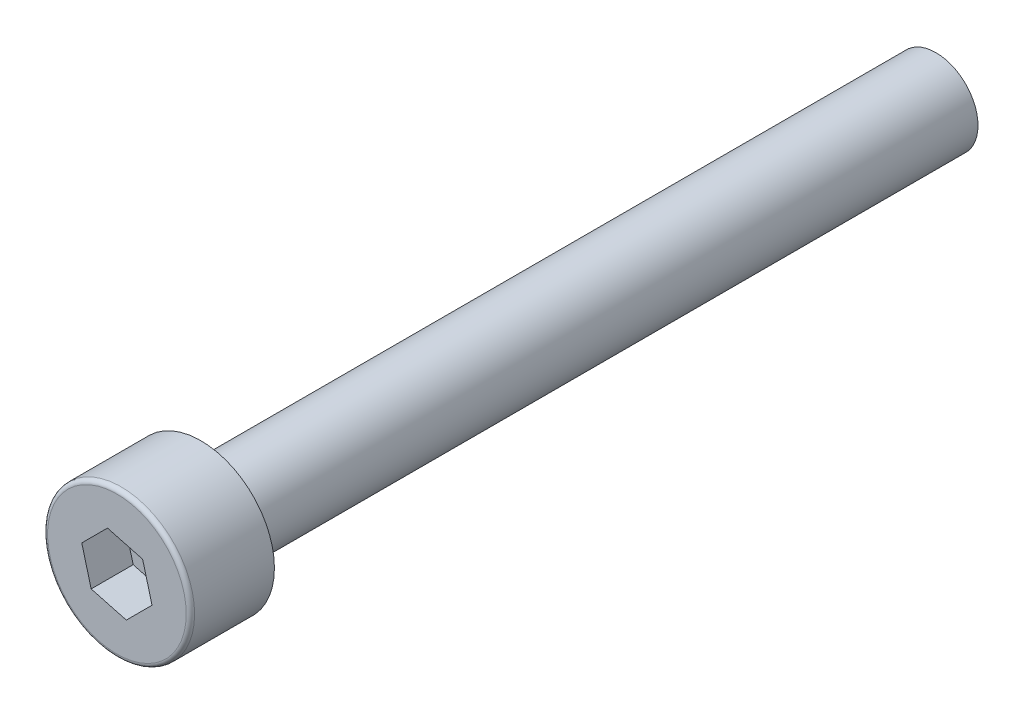
ISO-10303-21;
HEADER;
FILE_DESCRIPTION(('STEP AP214'),'2;1');
FILE_NAME('part.step','',(''),(''),'','','');
FILE_SCHEMA(('AUTOMOTIVE_DESIGN { 1 0 10303 214 1 1 1 1 }'));
ENDSEC;
DATA;
#1=APPLICATION_CONTEXT('core data for automotive mechanical design processes');
#2=APPLICATION_PROTOCOL_DEFINITION('international standard','automotive_design',2000,#1);
#3=PRODUCT_CONTEXT('',#1,'mechanical');
#4=PRODUCT('Part','Part','',(#3));
#5=PRODUCT_RELATED_PRODUCT_CATEGORY('part','',(#4));
#6=PRODUCT_DEFINITION_FORMATION('','',#4);
#7=PRODUCT_DEFINITION_CONTEXT('part definition',#1,'design');
#8=PRODUCT_DEFINITION('design','',#6,#7);
#9=PRODUCT_DEFINITION_SHAPE('','',#8);
#10=(LENGTH_UNIT() NAMED_UNIT(*) SI_UNIT(.MILLI.,.METRE.));
#11=(NAMED_UNIT(*) PLANE_ANGLE_UNIT() SI_UNIT($,.RADIAN.));
#12=(NAMED_UNIT(*) SI_UNIT($,.STERADIAN.) SOLID_ANGLE_UNIT());
#13=UNCERTAINTY_MEASURE_WITH_UNIT(LENGTH_MEASURE(1.E-05),#10,'distance_accuracy_value','');
#14=(GEOMETRIC_REPRESENTATION_CONTEXT(3) GLOBAL_UNCERTAINTY_ASSIGNED_CONTEXT((#13)) GLOBAL_UNIT_ASSIGNED_CONTEXT((#10,
#11,#12)) REPRESENTATION_CONTEXT('',''));
#15=CARTESIAN_POINT('',(0.,0.,0.));
#16=DIRECTION('',(0.,0.,1.));
#17=DIRECTION('',(1.,0.,0.));
#18=AXIS2_PLACEMENT_3D('',#15,#16,#17);
#19=CARTESIAN_POINT('',(0.,0.,0.));
#20=DIRECTION('',(0.,0.,1.));
#21=DIRECTION('',(1.,0.,0.));
#22=AXIS2_PLACEMENT_3D('',#19,#20,#21);
#23=PLANE('',#22);
#24=CARTESIAN_POINT('',(0.,0.,0.));
#25=DIRECTION('',(0.,0.,1.));
#26=DIRECTION('',(1.,0.,0.));
#27=AXIS2_PLACEMENT_3D('',#24,#25,#26);
#28=CIRCLE('',#27,3.5);
#29=CARTESIAN_POINT('',(3.5,0.,0.));
#30=VERTEX_POINT('',#29);
#31=EDGE_CURVE('E137',#30,#30,#28,.T.);
#32=ORIENTED_EDGE('',*,*,#31,.F.);
#33=EDGE_LOOP('',(#32));
#34=FACE_BOUND('',#33,.T.);
#35=CARTESIAN_POINT('',(0.,0.,0.));
#36=DIRECTION('',(0.,0.,1.));
#37=DIRECTION('',(1.,0.,0.));
#38=AXIS2_PLACEMENT_3D('',#35,#36,#37);
#39=CIRCLE('',#38,2.);
#40=CARTESIAN_POINT('',(2.,0.,0.));
#41=VERTEX_POINT('',#40);
#42=EDGE_CURVE('E145',#41,#41,#39,.F.);
#43=ORIENTED_EDGE('',*,*,#42,.F.);
#44=EDGE_LOOP('',(#43));
#45=FACE_BOUND('',#44,.T.);
#46=ADVANCED_FACE('F34',(#34,#45),#23,.F.);
#47=CARTESIAN_POINT('',(0.,0.,4.));
#48=DIRECTION('',(0.,0.,-1.));
#49=DIRECTION('',(-1.,0.,0.));
#50=AXIS2_PLACEMENT_3D('',#47,#48,#49);
#51=CYLINDRICAL_SURFACE('',#50,3.5);
#52=CARTESIAN_POINT('',(0.,0.,3.8));
#53=DIRECTION('',(0.,0.,1.));
#54=DIRECTION('',(1.,0.,0.));
#55=AXIS2_PLACEMENT_3D('',#52,#53,#54);
#56=CIRCLE('',#55,3.5);
#57=CARTESIAN_POINT('',(3.5,0.,3.8));
#58=VERTEX_POINT('',#57);
#59=EDGE_CURVE('E11',#58,#58,#56,.F.);
#60=ORIENTED_EDGE('',*,*,#59,.T.);
#61=EDGE_LOOP('',(#60));
#62=FACE_BOUND('',#61,.T.);
#63=ORIENTED_EDGE('',*,*,#31,.T.);
#64=EDGE_LOOP('',(#63));
#65=FACE_BOUND('',#64,.T.);
#66=ADVANCED_FACE('F164',(#62,#65),#51,.T.);
#67=CARTESIAN_POINT('',(0.,0.,4.));
#68=DIRECTION('',(0.,0.,1.));
#69=DIRECTION('',(1.,0.,0.));
#70=AXIS2_PLACEMENT_3D('',#67,#68,#69);
#71=PLANE('',#70);
#72=CARTESIAN_POINT('',(0.,0.,4.));
#73=DIRECTION('',(0.,0.,1.));
#74=DIRECTION('',(1.,0.,0.));
#75=AXIS2_PLACEMENT_3D('',#72,#73,#74);
#76=CIRCLE('',#75,3.3);
#77=CARTESIAN_POINT('',(3.3,0.,4.));
#78=VERTEX_POINT('',#77);
#79=EDGE_CURVE('E42',#78,#78,#76,.T.);
#80=ORIENTED_EDGE('',*,*,#79,.T.);
#81=EDGE_LOOP('',(#80));
#82=FACE_BOUND('',#81,.T.);
#83=DIRECTION('',(0.258819045102521,-0.965925826289068,0.));
#84=VECTOR('',#83,1.);
#85=CARTESIAN_POINT('',(-1.67303260747562,0.448287736084027,4.));
#86=LINE('',#85,#84);
#87=CARTESIAN_POINT('',(-1.67303260747562,0.448287736084027,4.));
#88=VERTEX_POINT('',#87);
#89=CARTESIAN_POINT('',(-1.22474487139159,-1.22474487139159,4.));
#90=VERTEX_POINT('',#89);
#91=EDGE_CURVE('E49',#88,#90,#86,.T.);
#92=ORIENTED_EDGE('',*,*,#91,.F.);
#93=DIRECTION('',(-0.707106781186547,-0.707106781186548,0.));
#94=VECTOR('',#93,1.);
#95=CARTESIAN_POINT('',(-0.448287736084027,1.67303260747562,4.));
#96=LINE('',#95,#94);
#97=CARTESIAN_POINT('',(-0.448287736084027,1.67303260747562,4.));
#98=VERTEX_POINT('',#97);
#99=EDGE_CURVE('E133',#98,#88,#96,.T.);
#100=ORIENTED_EDGE('',*,*,#99,.F.);
#101=DIRECTION('',(-0.965925826289068,0.258819045102521,0.));
#102=VECTOR('',#101,1.);
#103=CARTESIAN_POINT('',(1.22474487139159,1.22474487139159,4.));
#104=LINE('',#103,#102);
#105=CARTESIAN_POINT('',(1.22474487139159,1.22474487139159,4.));
#106=VERTEX_POINT('',#105);
#107=EDGE_CURVE('E131',#106,#98,#104,.T.);
#108=ORIENTED_EDGE('',*,*,#107,.F.);
#109=DIRECTION('',(-0.258819045102521,0.965925826289068,0.));
#110=VECTOR('',#109,1.);
#111=CARTESIAN_POINT('',(1.67303260747562,-0.448287736084027,4.));
#112=LINE('',#111,#110);
#113=CARTESIAN_POINT('',(1.67303260747562,-0.448287736084027,4.));
#114=VERTEX_POINT('',#113);
#115=EDGE_CURVE('E97',#114,#106,#112,.T.);
#116=ORIENTED_EDGE('',*,*,#115,.F.);
#117=DIRECTION('',(0.707106781186547,0.707106781186548,0.));
#118=VECTOR('',#117,1.);
#119=CARTESIAN_POINT('',(0.448287736084026,-1.67303260747562,4.));
#120=LINE('',#119,#118);
#121=CARTESIAN_POINT('',(0.448287736084026,-1.67303260747562,4.));
#122=VERTEX_POINT('',#121);
#123=EDGE_CURVE('E127',#122,#114,#120,.T.);
#124=ORIENTED_EDGE('',*,*,#123,.F.);
#125=DIRECTION('',(0.965925826289068,-0.258819045102521,0.));
#126=VECTOR('',#125,1.);
#127=CARTESIAN_POINT('',(-1.22474487139159,-1.22474487139159,4.));
#128=LINE('',#127,#126);
#129=EDGE_CURVE('E123',#90,#122,#128,.T.);
#130=ORIENTED_EDGE('',*,*,#129,.F.);
#131=EDGE_LOOP('',(#92,#100,#108,#116,#124,#130));
#132=FACE_BOUND('',#131,.T.);
#133=ADVANCED_FACE('F150',(#82,#132),#71,.T.);
#134=CARTESIAN_POINT('',(-1.67303260747562,0.448287736084027,2.));
#135=DIRECTION('',(-0.965925826289068,-0.258819045102521,0.));
#136=DIRECTION('',(0.258819045102521,-0.965925826289068,0.));
#137=AXIS2_PLACEMENT_3D('',#134,#135,#136);
#138=PLANE('',#137);
#139=ORIENTED_EDGE('',*,*,#91,.T.);
#140=DIRECTION('',(0.,0.,1.));
#141=VECTOR('',#140,1.);
#142=CARTESIAN_POINT('',(-1.22474487139159,-1.22474487139159,2.));
#143=LINE('',#142,#141);
#144=CARTESIAN_POINT('',(-1.22474487139159,-1.22474487139159,2.));
#145=VERTEX_POINT('',#144);
#146=EDGE_CURVE('E79',#145,#90,#143,.T.);
#147=ORIENTED_EDGE('',*,*,#146,.F.);
#148=DIRECTION('',(0.258819045102521,-0.965925826289068,0.));
#149=VECTOR('',#148,1.);
#150=CARTESIAN_POINT('',(-1.67303260747562,0.448287736084027,2.));
#151=LINE('',#150,#149);
#152=CARTESIAN_POINT('',(-1.67303260747562,0.448287736084027,2.));
#153=VERTEX_POINT('',#152);
#154=EDGE_CURVE('E135',#153,#145,#151,.T.);
#155=ORIENTED_EDGE('',*,*,#154,.F.);
#156=DIRECTION('',(0.,0.,1.));
#157=VECTOR('',#156,1.);
#158=CARTESIAN_POINT('',(-1.67303260747562,0.448287736084027,2.));
#159=LINE('',#158,#157);
#160=EDGE_CURVE('E57',#153,#88,#159,.T.);
#161=ORIENTED_EDGE('',*,*,#160,.T.);
#162=EDGE_LOOP('',(#139,#147,#155,#161));
#163=FACE_BOUND('',#162,.T.);
#164=ADVANCED_FACE('F176',(#163),#138,.F.);
#165=CARTESIAN_POINT('',(-0.448287736084027,1.67303260747562,2.));
#166=DIRECTION('',(-0.707106781186548,0.707106781186547,0.));
#167=DIRECTION('',(-0.707106781186547,-0.707106781186548,0.));
#168=AXIS2_PLACEMENT_3D('',#165,#166,#167);
#169=PLANE('',#168);
#170=ORIENTED_EDGE('',*,*,#99,.T.);
#171=ORIENTED_EDGE('',*,*,#160,.F.);
#172=DIRECTION('',(-0.707106781186547,-0.707106781186548,0.));
#173=VECTOR('',#172,1.);
#174=CARTESIAN_POINT('',(-0.448287736084027,1.67303260747562,2.));
#175=LINE('',#174,#173);
#176=CARTESIAN_POINT('',(-0.448287736084027,1.67303260747562,2.));
#177=VERTEX_POINT('',#176);
#178=EDGE_CURVE('E109',#177,#153,#175,.T.);
#179=ORIENTED_EDGE('',*,*,#178,.F.);
#180=DIRECTION('',(0.,0.,1.));
#181=VECTOR('',#180,1.);
#182=CARTESIAN_POINT('',(-0.448287736084027,1.67303260747562,2.));
#183=LINE('',#182,#181);
#184=EDGE_CURVE('E101',#177,#98,#183,.T.);
#185=ORIENTED_EDGE('',*,*,#184,.T.);
#186=EDGE_LOOP('',(#170,#171,#179,#185));
#187=FACE_BOUND('',#186,.T.);
#188=ADVANCED_FACE('F179',(#187),#169,.F.);
#189=CARTESIAN_POINT('',(1.22474487139159,1.22474487139159,2.));
#190=DIRECTION('',(0.258819045102521,0.965925826289068,0.));
#191=DIRECTION('',(-0.965925826289068,0.258819045102521,0.));
#192=AXIS2_PLACEMENT_3D('',#189,#190,#191);
#193=PLANE('',#192);
#194=ORIENTED_EDGE('',*,*,#107,.T.);
#195=ORIENTED_EDGE('',*,*,#184,.F.);
#196=DIRECTION('',(-0.965925826289068,0.258819045102521,0.));
#197=VECTOR('',#196,1.);
#198=CARTESIAN_POINT('',(1.22474487139159,1.22474487139159,2.));
#199=LINE('',#198,#197);
#200=CARTESIAN_POINT('',(1.22474487139159,1.22474487139159,2.));
#201=VERTEX_POINT('',#200);
#202=EDGE_CURVE('E105',#201,#177,#199,.T.);
#203=ORIENTED_EDGE('',*,*,#202,.F.);
#204=DIRECTION('',(0.,0.,1.));
#205=VECTOR('',#204,1.);
#206=CARTESIAN_POINT('',(1.22474487139159,1.22474487139159,2.));
#207=LINE('',#206,#205);
#208=EDGE_CURVE('E90',#201,#106,#207,.T.);
#209=ORIENTED_EDGE('',*,*,#208,.T.);
#210=EDGE_LOOP('',(#194,#195,#203,#209));
#211=FACE_BOUND('',#210,.T.);
#212=ADVANCED_FACE('F106',(#211),#193,.F.);
#213=CARTESIAN_POINT('',(1.67303260747562,-0.448287736084027,2.));
#214=DIRECTION('',(0.965925826289068,0.258819045102521,0.));
#215=DIRECTION('',(-0.258819045102521,0.965925826289068,0.));
#216=AXIS2_PLACEMENT_3D('',#213,#214,#215);
#217=PLANE('',#216);
#218=ORIENTED_EDGE('',*,*,#115,.T.);
#219=ORIENTED_EDGE('',*,*,#208,.F.);
#220=DIRECTION('',(-0.258819045102521,0.965925826289068,0.));
#221=VECTOR('',#220,1.);
#222=CARTESIAN_POINT('',(1.67303260747562,-0.448287736084027,2.));
#223=LINE('',#222,#221);
#224=CARTESIAN_POINT('',(1.67303260747562,-0.448287736084027,2.));
#225=VERTEX_POINT('',#224);
#226=EDGE_CURVE('E94',#225,#201,#223,.T.);
#227=ORIENTED_EDGE('',*,*,#226,.F.);
#228=DIRECTION('',(0.,0.,1.));
#229=VECTOR('',#228,1.);
#230=CARTESIAN_POINT('',(1.67303260747562,-0.448287736084027,2.));
#231=LINE('',#230,#229);
#232=EDGE_CURVE('E102',#225,#114,#231,.T.);
#233=ORIENTED_EDGE('',*,*,#232,.T.);
#234=EDGE_LOOP('',(#218,#219,#227,#233));
#235=FACE_BOUND('',#234,.T.);
#236=ADVANCED_FACE('F92',(#235),#217,.F.);
#237=CARTESIAN_POINT('',(0.448287736084026,-1.67303260747562,2.));
#238=DIRECTION('',(0.707106781186548,-0.707106781186547,0.));
#239=DIRECTION('',(0.707106781186547,0.707106781186548,0.));
#240=AXIS2_PLACEMENT_3D('',#237,#238,#239);
#241=PLANE('',#240);
#242=ORIENTED_EDGE('',*,*,#123,.T.);
#243=ORIENTED_EDGE('',*,*,#232,.F.);
#244=DIRECTION('',(0.707106781186547,0.707106781186548,0.));
#245=VECTOR('',#244,1.);
#246=CARTESIAN_POINT('',(0.448287736084026,-1.67303260747562,2.));
#247=LINE('',#246,#245);
#248=CARTESIAN_POINT('',(0.448287736084026,-1.67303260747562,2.));
#249=VERTEX_POINT('',#248);
#250=EDGE_CURVE('E115',#249,#225,#247,.T.);
#251=ORIENTED_EDGE('',*,*,#250,.F.);
#252=DIRECTION('',(0.,0.,1.));
#253=VECTOR('',#252,1.);
#254=CARTESIAN_POINT('',(0.448287736084026,-1.67303260747562,2.));
#255=LINE('',#254,#253);
#256=EDGE_CURVE('E140',#249,#122,#255,.T.);
#257=ORIENTED_EDGE('',*,*,#256,.T.);
#258=EDGE_LOOP('',(#242,#243,#251,#257));
#259=FACE_BOUND('',#258,.T.);
#260=ADVANCED_FACE('F183',(#259),#241,.F.);
#261=CARTESIAN_POINT('',(-1.22474487139159,-1.22474487139159,2.));
#262=DIRECTION('',(-0.258819045102521,-0.965925826289068,0.));
#263=DIRECTION('',(0.965925826289068,-0.258819045102521,0.));
#264=AXIS2_PLACEMENT_3D('',#261,#262,#263);
#265=PLANE('',#264);
#266=ORIENTED_EDGE('',*,*,#129,.T.);
#267=ORIENTED_EDGE('',*,*,#256,.F.);
#268=DIRECTION('',(0.965925826289068,-0.258819045102521,0.));
#269=VECTOR('',#268,1.);
#270=CARTESIAN_POINT('',(-1.22474487139159,-1.22474487139159,2.));
#271=LINE('',#270,#269);
#272=EDGE_CURVE('E117',#145,#249,#271,.T.);
#273=ORIENTED_EDGE('',*,*,#272,.F.);
#274=ORIENTED_EDGE('',*,*,#146,.T.);
#275=EDGE_LOOP('',(#266,#267,#273,#274));
#276=FACE_BOUND('',#275,.T.);
#277=ADVANCED_FACE('F180',(#276),#265,.F.);
#278=CARTESIAN_POINT('',(0.,0.,2.));
#279=DIRECTION('',(0.,0.,1.));
#280=DIRECTION('',(1.,0.,0.));
#281=AXIS2_PLACEMENT_3D('',#278,#279,#280);
#282=PLANE('',#281);
#283=ORIENTED_EDGE('',*,*,#154,.T.);
#284=ORIENTED_EDGE('',*,*,#272,.T.);
#285=ORIENTED_EDGE('',*,*,#250,.T.);
#286=ORIENTED_EDGE('',*,*,#226,.T.);
#287=ORIENTED_EDGE('',*,*,#202,.T.);
#288=ORIENTED_EDGE('',*,*,#178,.T.);
#289=EDGE_LOOP('',(#283,#284,#285,#286,#287,#288));
#290=FACE_BOUND('',#289,.T.);
#291=ADVANCED_FACE('F112',(#290),#282,.T.);
#292=CARTESIAN_POINT('',(0.,0.,-35.));
#293=DIRECTION('',(0.,0.,1.));
#294=DIRECTION('',(1.,0.,0.));
#295=AXIS2_PLACEMENT_3D('',#292,#293,#294);
#296=CYLINDRICAL_SURFACE('',#295,2.);
#297=CARTESIAN_POINT('',(0.,0.,-35.));
#298=DIRECTION('',(0.,0.,-1.));
#299=DIRECTION('',(-1.,0.,0.));
#300=AXIS2_PLACEMENT_3D('',#297,#298,#299);
#301=CIRCLE('',#300,2.);
#302=CARTESIAN_POINT('',(-2.,0.,-35.));
#303=VERTEX_POINT('',#302);
#304=EDGE_CURVE('E124',#303,#303,#301,.T.);
#305=ORIENTED_EDGE('',*,*,#304,.F.);
#306=EDGE_LOOP('',(#305));
#307=FACE_BOUND('',#306,.T.);
#308=ORIENTED_EDGE('',*,*,#42,.T.);
#309=EDGE_LOOP('',(#308));
#310=FACE_BOUND('',#309,.T.);
#311=ADVANCED_FACE('F159',(#307,#310),#296,.T.);
#312=CARTESIAN_POINT('',(0.,0.,-35.));
#313=DIRECTION('',(0.,0.,-1.));
#314=DIRECTION('',(-1.,0.,0.));
#315=AXIS2_PLACEMENT_3D('',#312,#313,#314);
#316=PLANE('',#315);
#317=ORIENTED_EDGE('',*,*,#304,.T.);
#318=EDGE_LOOP('',(#317));
#319=FACE_BOUND('',#318,.T.);
#320=ADVANCED_FACE('F154',(#319),#316,.T.);
#321=CARTESIAN_POINT('',(0.,0.,3.8));
#322=DIRECTION('',(0.,0.,1.));
#323=DIRECTION('',(1.,0.,0.));
#324=AXIS2_PLACEMENT_3D('',#321,#322,#323);
#325=TOROIDAL_SURFACE('',#324,3.3,0.2);
#326=ORIENTED_EDGE('',*,*,#59,.F.);
#327=EDGE_LOOP('',(#326));
#328=FACE_BOUND('',#327,.T.);
#329=ORIENTED_EDGE('',*,*,#79,.F.);
#330=EDGE_LOOP('',(#329));
#331=FACE_BOUND('',#330,.T.);
#332=ADVANCED_FACE('F36',(#328,#331),#325,.T.);
#333=CLOSED_SHELL('',(#46,#66,#133,#164,#188,#212,#236,#260,#277,#291,#311,#320,#332));
#334=MANIFOLD_SOLID_BREP('B2',#333);
#335=ADVANCED_BREP_SHAPE_REPRESENTATION('',(#18,#334),#14);
#336=SHAPE_DEFINITION_REPRESENTATION(#9,#335);
ENDSEC;
END-ISO-10303-21;
